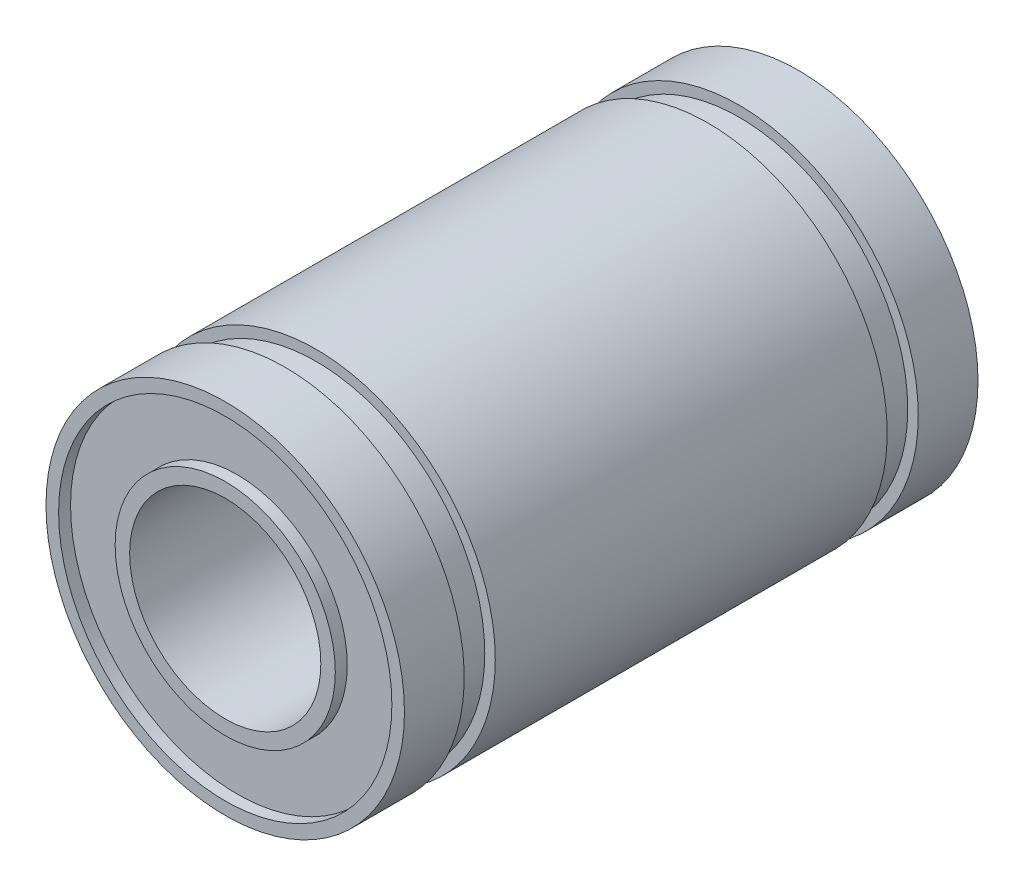
ISO-10303-21;
HEADER;
FILE_DESCRIPTION(('STEP AP214'),'2;1');
FILE_NAME('part.step','',(''),(''),'','','');
FILE_SCHEMA(('AUTOMOTIVE_DESIGN { 1 0 10303 214 1 1 1 1 }'));
ENDSEC;
DATA;
#1=APPLICATION_CONTEXT('core data for automotive mechanical design processes');
#2=APPLICATION_PROTOCOL_DEFINITION('international standard','automotive_design',2000,#1);
#3=PRODUCT_CONTEXT('',#1,'mechanical');
#4=PRODUCT('Part','Part','',(#3));
#5=PRODUCT_RELATED_PRODUCT_CATEGORY('part','',(#4));
#6=PRODUCT_DEFINITION_FORMATION('','',#4);
#7=PRODUCT_DEFINITION_CONTEXT('part definition',#1,'design');
#8=PRODUCT_DEFINITION('design','',#6,#7);
#9=PRODUCT_DEFINITION_SHAPE('','',#8);
#10=(LENGTH_UNIT() NAMED_UNIT(*) SI_UNIT(.MILLI.,.METRE.));
#11=(NAMED_UNIT(*) PLANE_ANGLE_UNIT() SI_UNIT($,.RADIAN.));
#12=(NAMED_UNIT(*) SI_UNIT($,.STERADIAN.) SOLID_ANGLE_UNIT());
#13=UNCERTAINTY_MEASURE_WITH_UNIT(LENGTH_MEASURE(1.E-05),#10,'distance_accuracy_value','');
#14=(GEOMETRIC_REPRESENTATION_CONTEXT(3) GLOBAL_UNCERTAINTY_ASSIGNED_CONTEXT((#13)) GLOBAL_UNIT_ASSIGNED_CONTEXT((#10,
#11,#12)) REPRESENTATION_CONTEXT('',''));
#15=CARTESIAN_POINT('',(0.,0.,0.));
#16=DIRECTION('',(0.,0.,1.));
#17=DIRECTION('',(1.,0.,0.));
#18=AXIS2_PLACEMENT_3D('',#15,#16,#17);
#19=CARTESIAN_POINT('',(0.,0.,12.));
#20=DIRECTION('',(0.,0.,1.));
#21=DIRECTION('',(1.,0.,0.));
#22=AXIS2_PLACEMENT_3D('',#19,#20,#21);
#23=PLANE('',#22);
#24=CARTESIAN_POINT('',(0.,0.,12.));
#25=DIRECTION('',(0.,0.,1.));
#26=DIRECTION('',(1.,0.,0.));
#27=AXIS2_PLACEMENT_3D('',#24,#25,#26);
#28=CIRCLE('',#27,4.);
#29=CARTESIAN_POINT('',(4.,0.,12.));
#30=VERTEX_POINT('',#29);
#31=EDGE_CURVE('E54',#30,#30,#28,.T.);
#32=ORIENTED_EDGE('',*,*,#31,.F.);
#33=EDGE_LOOP('',(#32));
#34=FACE_BOUND('',#33,.T.);
#35=CARTESIAN_POINT('',(0.,0.,12.));
#36=DIRECTION('',(0.,0.,-1.));
#37=DIRECTION('',(-1.,0.,0.));
#38=AXIS2_PLACEMENT_3D('',#35,#36,#37);
#39=CIRCLE('',#38,4.60638309141382);
#40=CARTESIAN_POINT('',(-4.60638309141382,0.,12.));
#41=VERTEX_POINT('',#40);
#42=EDGE_CURVE('E135',#41,#41,#39,.T.);
#43=ORIENTED_EDGE('',*,*,#42,.F.);
#44=EDGE_LOOP('',(#43));
#45=FACE_BOUND('',#44,.T.);
#46=ADVANCED_FACE('F41',(#34,#45),#23,.T.);
#47=CARTESIAN_POINT('',(0.,0.,-12.));
#48=DIRECTION('',(0.,0.,1.));
#49=DIRECTION('',(1.,0.,0.));
#50=AXIS2_PLACEMENT_3D('',#47,#48,#49);
#51=PLANE('',#50);
#52=CARTESIAN_POINT('',(0.,0.,-12.));
#53=DIRECTION('',(0.,0.,1.));
#54=DIRECTION('',(1.,0.,0.));
#55=AXIS2_PLACEMENT_3D('',#52,#53,#54);
#56=CIRCLE('',#55,4.);
#57=CARTESIAN_POINT('',(4.,0.,-12.));
#58=VERTEX_POINT('',#57);
#59=EDGE_CURVE('E57',#58,#58,#56,.T.);
#60=ORIENTED_EDGE('',*,*,#59,.T.);
#61=EDGE_LOOP('',(#60));
#62=FACE_BOUND('',#61,.T.);
#63=CARTESIAN_POINT('',(0.,0.,-12.));
#64=DIRECTION('',(0.,0.,-1.));
#65=DIRECTION('',(-1.,0.,0.));
#66=AXIS2_PLACEMENT_3D('',#63,#64,#65);
#67=CIRCLE('',#66,4.60638309141382);
#68=CARTESIAN_POINT('',(-4.60638309141382,0.,-12.));
#69=VERTEX_POINT('',#68);
#70=EDGE_CURVE('E132',#69,#69,#67,.T.);
#71=ORIENTED_EDGE('',*,*,#70,.T.);
#72=EDGE_LOOP('',(#71));
#73=FACE_BOUND('',#72,.T.);
#74=ADVANCED_FACE('F92',(#62,#73),#51,.F.);
#75=CARTESIAN_POINT('',(0.,0.,12.));
#76=DIRECTION('',(0.,0.,-1.));
#77=DIRECTION('',(-1.,0.,0.));
#78=AXIS2_PLACEMENT_3D('',#75,#76,#77);
#79=CYLINDRICAL_SURFACE('',#78,7.5);
#80=CARTESIAN_POINT('',(0.,0.,12.));
#81=DIRECTION('',(0.,0.,1.));
#82=DIRECTION('',(1.,0.,0.));
#83=AXIS2_PLACEMENT_3D('',#80,#81,#82);
#84=CIRCLE('',#83,7.5);
#85=CARTESIAN_POINT('',(7.5,0.,12.));
#86=VERTEX_POINT('',#85);
#87=EDGE_CURVE('E10',#86,#86,#84,.T.);
#88=ORIENTED_EDGE('',*,*,#87,.F.);
#89=EDGE_LOOP('',(#88));
#90=FACE_BOUND('',#89,.T.);
#91=CARTESIAN_POINT('',(0.,0.,9.5));
#92=DIRECTION('',(0.,0.,-1.));
#93=DIRECTION('',(-1.,0.,0.));
#94=AXIS2_PLACEMENT_3D('',#91,#92,#93);
#95=CIRCLE('',#94,7.5);
#96=CARTESIAN_POINT('',(-7.5,0.,9.5));
#97=VERTEX_POINT('',#96);
#98=EDGE_CURVE('E45',#97,#97,#95,.T.);
#99=ORIENTED_EDGE('',*,*,#98,.F.);
#100=EDGE_LOOP('',(#99));
#101=FACE_BOUND('',#100,.T.);
#102=ADVANCED_FACE('F43',(#90,#101),#79,.T.);
#103=CARTESIAN_POINT('',(0.,0.,-8.2));
#104=DIRECTION('',(0.,0.,-1.));
#105=DIRECTION('',(-1.,0.,0.));
#106=AXIS2_PLACEMENT_3D('',#103,#104,#105);
#107=CIRCLE('',#106,7.5);
#108=CARTESIAN_POINT('',(-7.5,0.,-8.2));
#109=VERTEX_POINT('',#108);
#110=EDGE_CURVE('E63',#109,#109,#107,.T.);
#111=ORIENTED_EDGE('',*,*,#110,.F.);
#112=EDGE_LOOP('',(#111));
#113=FACE_BOUND('',#112,.T.);
#114=CARTESIAN_POINT('',(0.,0.,8.2));
#115=DIRECTION('',(0.,0.,1.));
#116=DIRECTION('',(1.,0.,0.));
#117=AXIS2_PLACEMENT_3D('',#114,#115,#116);
#118=CIRCLE('',#117,7.5);
#119=CARTESIAN_POINT('',(7.5,0.,8.2));
#120=VERTEX_POINT('',#119);
#121=EDGE_CURVE('E66',#120,#120,#118,.T.);
#122=ORIENTED_EDGE('',*,*,#121,.F.);
#123=EDGE_LOOP('',(#122));
#124=FACE_BOUND('',#123,.T.);
#125=ADVANCED_FACE('F122',(#113,#124),#79,.T.);
#126=CARTESIAN_POINT('',(0.,0.,-12.));
#127=DIRECTION('',(0.,0.,1.));
#128=DIRECTION('',(1.,0.,0.));
#129=AXIS2_PLACEMENT_3D('',#126,#127,#128);
#130=CIRCLE('',#129,7.5);
#131=CARTESIAN_POINT('',(7.5,0.,-12.));
#132=VERTEX_POINT('',#131);
#133=EDGE_CURVE('E49',#132,#132,#130,.T.);
#134=ORIENTED_EDGE('',*,*,#133,.T.);
#135=EDGE_LOOP('',(#134));
#136=FACE_BOUND('',#135,.T.);
#137=CARTESIAN_POINT('',(0.,0.,-9.5));
#138=DIRECTION('',(0.,0.,1.));
#139=DIRECTION('',(1.,0.,0.));
#140=AXIS2_PLACEMENT_3D('',#137,#138,#139);
#141=CIRCLE('',#140,7.5);
#142=CARTESIAN_POINT('',(7.5,0.,-9.5));
#143=VERTEX_POINT('',#142);
#144=EDGE_CURVE('E60',#143,#143,#141,.T.);
#145=ORIENTED_EDGE('',*,*,#144,.F.);
#146=EDGE_LOOP('',(#145));
#147=FACE_BOUND('',#146,.T.);
#148=ADVANCED_FACE('F117',(#136,#147),#79,.T.);
#149=CARTESIAN_POINT('',(0.,0.,12.));
#150=DIRECTION('',(0.,0.,-1.));
#151=DIRECTION('',(-1.,0.,0.));
#152=AXIS2_PLACEMENT_3D('',#149,#150,#151);
#153=CIRCLE('',#152,6.97294129068912);
#154=CARTESIAN_POINT('',(-6.97294129068912,0.,12.));
#155=VERTEX_POINT('',#154);
#156=EDGE_CURVE('E126',#155,#155,#153,.T.);
#157=ORIENTED_EDGE('',*,*,#156,.T.);
#158=EDGE_LOOP('',(#157));
#159=FACE_BOUND('',#158,.T.);
#160=ORIENTED_EDGE('',*,*,#87,.T.);
#161=EDGE_LOOP('',(#160));
#162=FACE_BOUND('',#161,.T.);
#163=ADVANCED_FACE('F107',(#159,#162),#23,.T.);
#164=CARTESIAN_POINT('',(0.,0.,-12.));
#165=DIRECTION('',(0.,0.,-1.));
#166=DIRECTION('',(-1.,0.,0.));
#167=AXIS2_PLACEMENT_3D('',#164,#165,#166);
#168=CIRCLE('',#167,6.97294129068912);
#169=CARTESIAN_POINT('',(-6.97294129068912,0.,-12.));
#170=VERTEX_POINT('',#169);
#171=EDGE_CURVE('E142',#170,#170,#168,.T.);
#172=ORIENTED_EDGE('',*,*,#171,.F.);
#173=EDGE_LOOP('',(#172));
#174=FACE_BOUND('',#173,.T.);
#175=ORIENTED_EDGE('',*,*,#133,.F.);
#176=EDGE_LOOP('',(#175));
#177=FACE_BOUND('',#176,.T.);
#178=ADVANCED_FACE('F98',(#174,#177),#51,.F.);
#179=CARTESIAN_POINT('',(0.,0.,12.));
#180=DIRECTION('',(0.,0.,-1.));
#181=DIRECTION('',(-1.,0.,0.));
#182=AXIS2_PLACEMENT_3D('',#179,#180,#181);
#183=CYLINDRICAL_SURFACE('',#182,4.);
#184=ORIENTED_EDGE('',*,*,#31,.T.);
#185=EDGE_LOOP('',(#184));
#186=FACE_BOUND('',#185,.T.);
#187=ORIENTED_EDGE('',*,*,#59,.F.);
#188=EDGE_LOOP('',(#187));
#189=FACE_BOUND('',#188,.T.);
#190=ADVANCED_FACE('F95',(#186,#189),#183,.F.);
#191=CARTESIAN_POINT('',(7.99457965207147,0.,-8.2));
#192=DIRECTION('',(0.,0.,-1.));
#193=DIRECTION('',(-1.,0.,0.));
#194=AXIS2_PLACEMENT_3D('',#191,#192,#193);
#195=PLANE('',#194);
#196=CARTESIAN_POINT('',(0.,0.,-8.2));
#197=DIRECTION('',(0.,0.,-1.));
#198=DIRECTION('',(-1.,0.,0.));
#199=AXIS2_PLACEMENT_3D('',#196,#197,#198);
#200=CIRCLE('',#199,7.06045407366765);
#201=CARTESIAN_POINT('',(-7.06045407366765,0.,-8.2));
#202=VERTEX_POINT('',#201);
#203=EDGE_CURVE('E64',#202,#202,#200,.T.);
#204=ORIENTED_EDGE('',*,*,#203,.F.);
#205=EDGE_LOOP('',(#204));
#206=FACE_BOUND('',#205,.T.);
#207=ORIENTED_EDGE('',*,*,#110,.T.);
#208=EDGE_LOOP('',(#207));
#209=FACE_BOUND('',#208,.T.);
#210=ADVANCED_FACE('F97',(#206,#209),#195,.T.);
#211=CARTESIAN_POINT('',(7.99457965207147,0.,-9.5));
#212=DIRECTION('',(0.,0.,1.));
#213=DIRECTION('',(1.,0.,0.));
#214=AXIS2_PLACEMENT_3D('',#211,#212,#213);
#215=PLANE('',#214);
#216=CARTESIAN_POINT('',(0.,0.,-9.5));
#217=DIRECTION('',(0.,0.,-1.));
#218=DIRECTION('',(-1.,0.,0.));
#219=AXIS2_PLACEMENT_3D('',#216,#217,#218);
#220=CIRCLE('',#219,7.06045407366765);
#221=CARTESIAN_POINT('',(-7.06045407366765,0.,-9.5));
#222=VERTEX_POINT('',#221);
#223=EDGE_CURVE('E72',#222,#222,#220,.T.);
#224=ORIENTED_EDGE('',*,*,#223,.T.);
#225=EDGE_LOOP('',(#224));
#226=FACE_BOUND('',#225,.T.);
#227=ORIENTED_EDGE('',*,*,#144,.T.);
#228=EDGE_LOOP('',(#227));
#229=FACE_BOUND('',#228,.T.);
#230=ADVANCED_FACE('F104',(#226,#229),#215,.T.);
#231=CARTESIAN_POINT('',(0.,0.,-13.6469701227416));
#232=DIRECTION('',(0.,0.,-1.));
#233=DIRECTION('',(-1.,0.,0.));
#234=AXIS2_PLACEMENT_3D('',#231,#232,#233);
#235=CYLINDRICAL_SURFACE('',#234,7.06045407366765);
#236=ORIENTED_EDGE('',*,*,#203,.T.);
#237=EDGE_LOOP('',(#236));
#238=FACE_BOUND('',#237,.T.);
#239=ORIENTED_EDGE('',*,*,#223,.F.);
#240=EDGE_LOOP('',(#239));
#241=FACE_BOUND('',#240,.T.);
#242=ADVANCED_FACE('F156',(#238,#241),#235,.T.);
#243=CARTESIAN_POINT('',(7.99457965207147,0.,9.5));
#244=DIRECTION('',(0.,0.,-1.));
#245=DIRECTION('',(-1.,0.,0.));
#246=AXIS2_PLACEMENT_3D('',#243,#244,#245);
#247=PLANE('',#246);
#248=CARTESIAN_POINT('',(0.,0.,9.5));
#249=DIRECTION('',(0.,0.,-1.));
#250=DIRECTION('',(-1.,0.,0.));
#251=AXIS2_PLACEMENT_3D('',#248,#249,#250);
#252=CIRCLE('',#251,7.06045407366765);
#253=CARTESIAN_POINT('',(-7.06045407366765,0.,9.5));
#254=VERTEX_POINT('',#253);
#255=EDGE_CURVE('E68',#254,#254,#252,.T.);
#256=ORIENTED_EDGE('',*,*,#255,.F.);
#257=EDGE_LOOP('',(#256));
#258=FACE_BOUND('',#257,.T.);
#259=ORIENTED_EDGE('',*,*,#98,.T.);
#260=EDGE_LOOP('',(#259));
#261=FACE_BOUND('',#260,.T.);
#262=ADVANCED_FACE('F162',(#258,#261),#247,.T.);
#263=CARTESIAN_POINT('',(7.99457965207147,0.,8.2));
#264=DIRECTION('',(0.,0.,1.));
#265=DIRECTION('',(1.,0.,0.));
#266=AXIS2_PLACEMENT_3D('',#263,#264,#265);
#267=PLANE('',#266);
#268=CARTESIAN_POINT('',(0.,0.,8.2));
#269=DIRECTION('',(0.,0.,-1.));
#270=DIRECTION('',(-1.,0.,0.));
#271=AXIS2_PLACEMENT_3D('',#268,#269,#270);
#272=CIRCLE('',#271,7.06045407366765);
#273=CARTESIAN_POINT('',(-7.06045407366765,0.,8.2));
#274=VERTEX_POINT('',#273);
#275=EDGE_CURVE('E74',#274,#274,#272,.T.);
#276=ORIENTED_EDGE('',*,*,#275,.T.);
#277=EDGE_LOOP('',(#276));
#278=FACE_BOUND('',#277,.T.);
#279=ORIENTED_EDGE('',*,*,#121,.T.);
#280=EDGE_LOOP('',(#279));
#281=FACE_BOUND('',#280,.T.);
#282=ADVANCED_FACE('F168',(#278,#281),#267,.T.);
#283=CARTESIAN_POINT('',(0.,0.,-13.6469701227416));
#284=DIRECTION('',(0.,0.,-1.));
#285=DIRECTION('',(-1.,0.,0.));
#286=AXIS2_PLACEMENT_3D('',#283,#284,#285);
#287=CYLINDRICAL_SURFACE('',#286,7.06045407366765);
#288=ORIENTED_EDGE('',*,*,#255,.T.);
#289=EDGE_LOOP('',(#288));
#290=FACE_BOUND('',#289,.T.);
#291=ORIENTED_EDGE('',*,*,#275,.F.);
#292=EDGE_LOOP('',(#291));
#293=FACE_BOUND('',#292,.T.);
#294=ADVANCED_FACE('F170',(#290,#293),#287,.T.);
#295=CARTESIAN_POINT('',(0.,0.,-11.5));
#296=DIRECTION('',(0.,0.,-1.));
#297=DIRECTION('',(-1.,0.,0.));
#298=AXIS2_PLACEMENT_3D('',#295,#296,#297);
#299=CYLINDRICAL_SURFACE('',#298,6.97294129068912);
#300=CARTESIAN_POINT('',(0.,0.,-11.5));
#301=DIRECTION('',(0.,0.,-1.));
#302=DIRECTION('',(-1.,0.,0.));
#303=AXIS2_PLACEMENT_3D('',#300,#301,#302);
#304=CIRCLE('',#303,6.97294129068912);
#305=CARTESIAN_POINT('',(-6.97294129068912,0.,-11.5));
#306=VERTEX_POINT('',#305);
#307=EDGE_CURVE('E79',#306,#306,#304,.T.);
#308=ORIENTED_EDGE('',*,*,#307,.F.);
#309=EDGE_LOOP('',(#308));
#310=FACE_BOUND('',#309,.T.);
#311=ORIENTED_EDGE('',*,*,#171,.T.);
#312=EDGE_LOOP('',(#311));
#313=FACE_BOUND('',#312,.T.);
#314=ADVANCED_FACE('F149',(#310,#313),#299,.F.);
#315=CARTESIAN_POINT('',(0.,0.,-11.5));
#316=DIRECTION('',(0.,0.,-1.));
#317=DIRECTION('',(-1.,0.,0.));
#318=AXIS2_PLACEMENT_3D('',#315,#316,#317);
#319=PLANE('',#318);
#320=CARTESIAN_POINT('',(0.,0.,-11.5));
#321=DIRECTION('',(0.,0.,-1.));
#322=DIRECTION('',(-1.,0.,0.));
#323=AXIS2_PLACEMENT_3D('',#320,#321,#322);
#324=CIRCLE('',#323,4.60638309141382);
#325=CARTESIAN_POINT('',(-4.60638309141382,0.,-11.5));
#326=VERTEX_POINT('',#325);
#327=EDGE_CURVE('E139',#326,#326,#324,.T.);
#328=ORIENTED_EDGE('',*,*,#327,.F.);
#329=EDGE_LOOP('',(#328));
#330=FACE_BOUND('',#329,.T.);
#331=ORIENTED_EDGE('',*,*,#307,.T.);
#332=EDGE_LOOP('',(#331));
#333=FACE_BOUND('',#332,.T.);
#334=ADVANCED_FACE('F178',(#330,#333),#319,.T.);
#335=CARTESIAN_POINT('',(0.,0.,-11.5));
#336=DIRECTION('',(0.,0.,-1.));
#337=DIRECTION('',(-1.,0.,0.));
#338=AXIS2_PLACEMENT_3D('',#335,#336,#337);
#339=CYLINDRICAL_SURFACE('',#338,4.60638309141382);
#340=ORIENTED_EDGE('',*,*,#327,.T.);
#341=EDGE_LOOP('',(#340));
#342=FACE_BOUND('',#341,.T.);
#343=ORIENTED_EDGE('',*,*,#70,.F.);
#344=EDGE_LOOP('',(#343));
#345=FACE_BOUND('',#344,.T.);
#346=ADVANCED_FACE('F182',(#342,#345),#339,.T.);
#347=CARTESIAN_POINT('',(0.,0.,11.5));
#348=DIRECTION('',(0.,0.,1.));
#349=DIRECTION('',(-1.,0.,0.));
#350=AXIS2_PLACEMENT_3D('',#347,#348,#349);
#351=PLANE('',#350);
#352=CARTESIAN_POINT('',(0.,0.,11.5));
#353=DIRECTION('',(0.,0.,-1.));
#354=DIRECTION('',(-1.,0.,0.));
#355=AXIS2_PLACEMENT_3D('',#352,#353,#354);
#356=CIRCLE('',#355,6.97294129068912);
#357=CARTESIAN_POINT('',(-6.97294129068912,0.,11.5));
#358=VERTEX_POINT('',#357);
#359=EDGE_CURVE('E128',#358,#358,#356,.T.);
#360=ORIENTED_EDGE('',*,*,#359,.F.);
#361=EDGE_LOOP('',(#360));
#362=FACE_BOUND('',#361,.T.);
#363=CARTESIAN_POINT('',(0.,0.,11.5));
#364=DIRECTION('',(0.,0.,-1.));
#365=DIRECTION('',(-1.,0.,0.));
#366=AXIS2_PLACEMENT_3D('',#363,#364,#365);
#367=CIRCLE('',#366,4.60638309141382);
#368=CARTESIAN_POINT('',(-4.60638309141382,0.,11.5));
#369=VERTEX_POINT('',#368);
#370=EDGE_CURVE('E129',#369,#369,#367,.T.);
#371=ORIENTED_EDGE('',*,*,#370,.T.);
#372=EDGE_LOOP('',(#371));
#373=FACE_BOUND('',#372,.T.);
#374=ADVANCED_FACE('F186',(#362,#373),#351,.T.);
#375=CARTESIAN_POINT('',(0.,0.,11.5));
#376=DIRECTION('',(0.,0.,1.));
#377=DIRECTION('',(1.,0.,0.));
#378=AXIS2_PLACEMENT_3D('',#375,#376,#377);
#379=CYLINDRICAL_SURFACE('',#378,6.97294129068912);
#380=ORIENTED_EDGE('',*,*,#359,.T.);
#381=EDGE_LOOP('',(#380));
#382=FACE_BOUND('',#381,.T.);
#383=ORIENTED_EDGE('',*,*,#156,.F.);
#384=EDGE_LOOP('',(#383));
#385=FACE_BOUND('',#384,.T.);
#386=ADVANCED_FACE('F188',(#382,#385),#379,.F.);
#387=CARTESIAN_POINT('',(0.,0.,11.5));
#388=DIRECTION('',(0.,0.,1.));
#389=DIRECTION('',(1.,0.,0.));
#390=AXIS2_PLACEMENT_3D('',#387,#388,#389);
#391=CYLINDRICAL_SURFACE('',#390,4.60638309141382);
#392=ORIENTED_EDGE('',*,*,#370,.F.);
#393=EDGE_LOOP('',(#392));
#394=FACE_BOUND('',#393,.T.);
#395=ORIENTED_EDGE('',*,*,#42,.T.);
#396=EDGE_LOOP('',(#395));
#397=FACE_BOUND('',#396,.T.);
#398=ADVANCED_FACE('F191',(#394,#397),#391,.T.);
#399=CLOSED_SHELL('',(#46,#74,#102,#125,#148,#163,#178,#190,#210,#230,#242,#262,#282,#294,#314,
#334,#346,#374,#386,#398));
#400=MANIFOLD_SOLID_BREP('B2',#399);
#401=ADVANCED_BREP_SHAPE_REPRESENTATION('',(#18,#400),#14);
#402=SHAPE_DEFINITION_REPRESENTATION(#9,#401);
ENDSEC;
END-ISO-10303-21;
